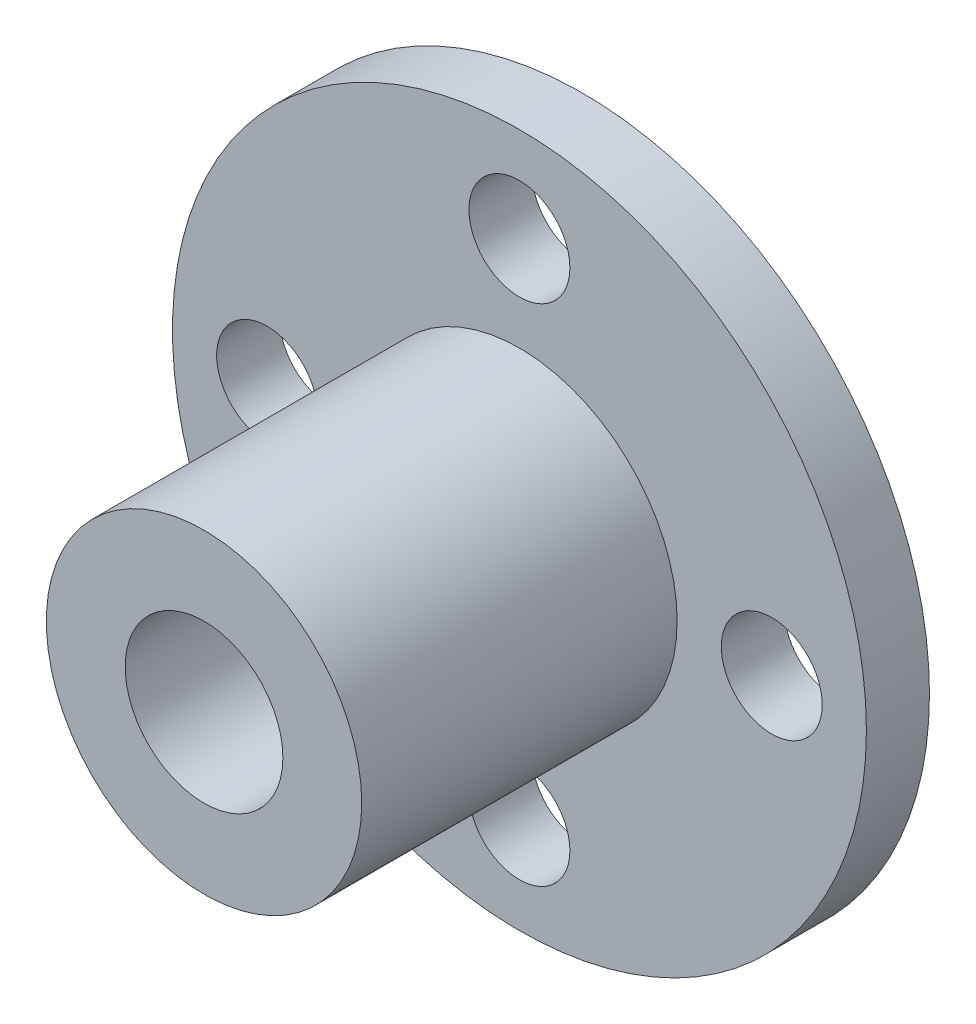
ISO-10303-21;
HEADER;
FILE_DESCRIPTION(('STEP AP214'),'2;1');
FILE_NAME('part.step','',(''),(''),'','','');
FILE_SCHEMA(('AUTOMOTIVE_DESIGN { 1 0 10303 214 1 1 1 1 }'));
ENDSEC;
DATA;
#1=APPLICATION_CONTEXT('core data for automotive mechanical design processes');
#2=APPLICATION_PROTOCOL_DEFINITION('international standard','automotive_design',2000,#1);
#3=PRODUCT_CONTEXT('',#1,'mechanical');
#4=PRODUCT('Part','Part','',(#3));
#5=PRODUCT_RELATED_PRODUCT_CATEGORY('part','',(#4));
#6=PRODUCT_DEFINITION_FORMATION('','',#4);
#7=PRODUCT_DEFINITION_CONTEXT('part definition',#1,'design');
#8=PRODUCT_DEFINITION('design','',#6,#7);
#9=PRODUCT_DEFINITION_SHAPE('','',#8);
#10=(LENGTH_UNIT() NAMED_UNIT(*) SI_UNIT(.MILLI.,.METRE.));
#11=(NAMED_UNIT(*) PLANE_ANGLE_UNIT() SI_UNIT($,.RADIAN.));
#12=(NAMED_UNIT(*) SI_UNIT($,.STERADIAN.) SOLID_ANGLE_UNIT());
#13=UNCERTAINTY_MEASURE_WITH_UNIT(LENGTH_MEASURE(1.E-05),#10,'distance_accuracy_value','');
#14=(GEOMETRIC_REPRESENTATION_CONTEXT(3) GLOBAL_UNCERTAINTY_ASSIGNED_CONTEXT((#13)) GLOBAL_UNIT_ASSIGNED_CONTEXT((#10,
#11,#12)) REPRESENTATION_CONTEXT('',''));
#15=CARTESIAN_POINT('',(0.,0.,0.));
#16=DIRECTION('',(0.,0.,1.));
#17=DIRECTION('',(1.,0.,0.));
#18=AXIS2_PLACEMENT_3D('',#15,#16,#17);
#19=CARTESIAN_POINT('',(0.,0.,2.));
#20=DIRECTION('',(0.,0.,-1.));
#21=DIRECTION('',(-1.,0.,0.));
#22=AXIS2_PLACEMENT_3D('',#19,#20,#21);
#23=CYLINDRICAL_SURFACE('',#22,11.);
#24=CARTESIAN_POINT('',(0.,0.,2.));
#25=DIRECTION('',(0.,0.,1.));
#26=DIRECTION('',(1.,0.,0.));
#27=AXIS2_PLACEMENT_3D('',#24,#25,#26);
#28=CIRCLE('',#27,11.);
#29=CARTESIAN_POINT('',(11.,0.,2.));
#30=VERTEX_POINT('',#29);
#31=EDGE_CURVE('E10',#30,#30,#28,.T.);
#32=ORIENTED_EDGE('',*,*,#31,.F.);
#33=EDGE_LOOP('',(#32));
#34=FACE_BOUND('',#33,.T.);
#35=CARTESIAN_POINT('',(0.,0.,0.));
#36=DIRECTION('',(0.,0.,1.));
#37=DIRECTION('',(1.,0.,0.));
#38=AXIS2_PLACEMENT_3D('',#35,#36,#37);
#39=CIRCLE('',#38,11.);
#40=CARTESIAN_POINT('',(11.,0.,0.));
#41=VERTEX_POINT('',#40);
#42=EDGE_CURVE('E39',#41,#41,#39,.T.);
#43=ORIENTED_EDGE('',*,*,#42,.T.);
#44=EDGE_LOOP('',(#43));
#45=FACE_BOUND('',#44,.T.);
#46=ADVANCED_FACE('F32',(#34,#45),#23,.T.);
#47=CARTESIAN_POINT('',(0.,0.,2.));
#48=DIRECTION('',(0.,0.,1.));
#49=DIRECTION('',(1.,0.,0.));
#50=AXIS2_PLACEMENT_3D('',#47,#48,#49);
#51=PLANE('',#50);
#52=CARTESIAN_POINT('',(8.,0.,2.));
#53=DIRECTION('',(0.,0.,1.));
#54=DIRECTION('',(1.,0.,0.));
#55=AXIS2_PLACEMENT_3D('',#52,#53,#54);
#56=CIRCLE('',#55,1.6);
#57=CARTESIAN_POINT('',(9.6,0.,2.));
#58=VERTEX_POINT('',#57);
#59=EDGE_CURVE('E63',#58,#58,#56,.T.);
#60=ORIENTED_EDGE('',*,*,#59,.F.);
#61=EDGE_LOOP('',(#60));
#62=FACE_BOUND('',#61,.T.);
#63=CARTESIAN_POINT('',(-8.,0.,2.));
#64=DIRECTION('',(0.,0.,1.));
#65=DIRECTION('',(1.,0.,0.));
#66=AXIS2_PLACEMENT_3D('',#63,#64,#65);
#67=CIRCLE('',#66,1.6);
#68=CARTESIAN_POINT('',(-6.4,0.,2.));
#69=VERTEX_POINT('',#68);
#70=EDGE_CURVE('E52',#69,#69,#67,.T.);
#71=ORIENTED_EDGE('',*,*,#70,.F.);
#72=EDGE_LOOP('',(#71));
#73=FACE_BOUND('',#72,.T.);
#74=CARTESIAN_POINT('',(0.,-8.,2.));
#75=DIRECTION('',(0.,0.,1.));
#76=DIRECTION('',(1.,0.,0.));
#77=AXIS2_PLACEMENT_3D('',#74,#75,#76);
#78=CIRCLE('',#77,1.6);
#79=CARTESIAN_POINT('',(1.6,-8.,2.));
#80=VERTEX_POINT('',#79);
#81=EDGE_CURVE('E51',#80,#80,#78,.T.);
#82=ORIENTED_EDGE('',*,*,#81,.F.);
#83=EDGE_LOOP('',(#82));
#84=FACE_BOUND('',#83,.T.);
#85=CARTESIAN_POINT('',(0.,8.,2.));
#86=DIRECTION('',(0.,0.,1.));
#87=DIRECTION('',(1.,0.,0.));
#88=AXIS2_PLACEMENT_3D('',#85,#86,#87);
#89=CIRCLE('',#88,1.6);
#90=CARTESIAN_POINT('',(1.6,8.,2.));
#91=VERTEX_POINT('',#90);
#92=EDGE_CURVE('E68',#91,#91,#89,.T.);
#93=ORIENTED_EDGE('',*,*,#92,.F.);
#94=EDGE_LOOP('',(#93));
#95=FACE_BOUND('',#94,.T.);
#96=CARTESIAN_POINT('',(0.,0.,2.));
#97=DIRECTION('',(0.,0.,1.));
#98=DIRECTION('',(1.,0.,0.));
#99=AXIS2_PLACEMENT_3D('',#96,#97,#98);
#100=CIRCLE('',#99,5.);
#101=CARTESIAN_POINT('',(5.,0.,2.));
#102=VERTEX_POINT('',#101);
#103=EDGE_CURVE('E47',#102,#102,#100,.T.);
#104=ORIENTED_EDGE('',*,*,#103,.F.);
#105=EDGE_LOOP('',(#104));
#106=FACE_BOUND('',#105,.T.);
#107=ORIENTED_EDGE('',*,*,#31,.T.);
#108=EDGE_LOOP('',(#107));
#109=FACE_BOUND('',#108,.T.);
#110=ADVANCED_FACE('F87',(#62,#73,#84,#95,#106,#109),#51,.T.);
#111=CARTESIAN_POINT('',(0.,0.,0.));
#112=DIRECTION('',(0.,0.,1.));
#113=DIRECTION('',(1.,0.,0.));
#114=AXIS2_PLACEMENT_3D('',#111,#112,#113);
#115=PLANE('',#114);
#116=CARTESIAN_POINT('',(8.,0.,0.));
#117=DIRECTION('',(0.,0.,1.));
#118=DIRECTION('',(1.,0.,0.));
#119=AXIS2_PLACEMENT_3D('',#116,#117,#118);
#120=CIRCLE('',#119,1.6);
#121=CARTESIAN_POINT('',(9.6,0.,0.));
#122=VERTEX_POINT('',#121);
#123=EDGE_CURVE('E35',#122,#122,#120,.T.);
#124=ORIENTED_EDGE('',*,*,#123,.T.);
#125=EDGE_LOOP('',(#124));
#126=FACE_BOUND('',#125,.T.);
#127=CARTESIAN_POINT('',(-8.,0.,0.));
#128=DIRECTION('',(0.,0.,1.));
#129=DIRECTION('',(1.,0.,0.));
#130=AXIS2_PLACEMENT_3D('',#127,#128,#129);
#131=CIRCLE('',#130,1.6);
#132=CARTESIAN_POINT('',(-6.4,0.,0.));
#133=VERTEX_POINT('',#132);
#134=EDGE_CURVE('E49',#133,#133,#131,.T.);
#135=ORIENTED_EDGE('',*,*,#134,.T.);
#136=EDGE_LOOP('',(#135));
#137=FACE_BOUND('',#136,.T.);
#138=CARTESIAN_POINT('',(0.,-8.,0.));
#139=DIRECTION('',(0.,0.,1.));
#140=DIRECTION('',(1.,0.,0.));
#141=AXIS2_PLACEMENT_3D('',#138,#139,#140);
#142=CIRCLE('',#141,1.6);
#143=CARTESIAN_POINT('',(1.6,-8.,0.));
#144=VERTEX_POINT('',#143);
#145=EDGE_CURVE('E56',#144,#144,#142,.T.);
#146=ORIENTED_EDGE('',*,*,#145,.T.);
#147=EDGE_LOOP('',(#146));
#148=FACE_BOUND('',#147,.T.);
#149=CARTESIAN_POINT('',(0.,8.,0.));
#150=DIRECTION('',(0.,0.,1.));
#151=DIRECTION('',(1.,0.,0.));
#152=AXIS2_PLACEMENT_3D('',#149,#150,#151);
#153=CIRCLE('',#152,1.6);
#154=CARTESIAN_POINT('',(1.6,8.,0.));
#155=VERTEX_POINT('',#154);
#156=EDGE_CURVE('E71',#155,#155,#153,.T.);
#157=ORIENTED_EDGE('',*,*,#156,.T.);
#158=EDGE_LOOP('',(#157));
#159=FACE_BOUND('',#158,.T.);
#160=CARTESIAN_POINT('',(0.,0.,0.));
#161=DIRECTION('',(0.,0.,1.));
#162=DIRECTION('',(1.,0.,0.));
#163=AXIS2_PLACEMENT_3D('',#160,#161,#162);
#164=CIRCLE('',#163,2.5);
#165=CARTESIAN_POINT('',(2.5,0.,0.));
#166=VERTEX_POINT('',#165);
#167=EDGE_CURVE('E75',#166,#166,#164,.T.);
#168=ORIENTED_EDGE('',*,*,#167,.T.);
#169=EDGE_LOOP('',(#168));
#170=FACE_BOUND('',#169,.T.);
#171=ORIENTED_EDGE('',*,*,#42,.F.);
#172=EDGE_LOOP('',(#171));
#173=FACE_BOUND('',#172,.T.);
#174=ADVANCED_FACE('F89',(#126,#137,#148,#159,#170,#173),#115,.F.);
#175=CARTESIAN_POINT('',(0.,0.,12.));
#176=DIRECTION('',(0.,0.,-1.));
#177=DIRECTION('',(-1.,0.,0.));
#178=AXIS2_PLACEMENT_3D('',#175,#176,#177);
#179=CYLINDRICAL_SURFACE('',#178,5.);
#180=CARTESIAN_POINT('',(0.,0.,12.));
#181=DIRECTION('',(0.,0.,1.));
#182=DIRECTION('',(1.,0.,0.));
#183=AXIS2_PLACEMENT_3D('',#180,#181,#182);
#184=CIRCLE('',#183,5.);
#185=CARTESIAN_POINT('',(5.,0.,12.));
#186=VERTEX_POINT('',#185);
#187=EDGE_CURVE('E44',#186,#186,#184,.T.);
#188=ORIENTED_EDGE('',*,*,#187,.F.);
#189=EDGE_LOOP('',(#188));
#190=FACE_BOUND('',#189,.T.);
#191=ORIENTED_EDGE('',*,*,#103,.T.);
#192=EDGE_LOOP('',(#191));
#193=FACE_BOUND('',#192,.T.);
#194=ADVANCED_FACE('F85',(#190,#193),#179,.T.);
#195=CARTESIAN_POINT('',(0.,0.,12.));
#196=DIRECTION('',(0.,0.,1.));
#197=DIRECTION('',(1.,0.,0.));
#198=AXIS2_PLACEMENT_3D('',#195,#196,#197);
#199=PLANE('',#198);
#200=CARTESIAN_POINT('',(0.,0.,12.));
#201=DIRECTION('',(0.,0.,1.));
#202=DIRECTION('',(1.,0.,0.));
#203=AXIS2_PLACEMENT_3D('',#200,#201,#202);
#204=CIRCLE('',#203,2.5);
#205=CARTESIAN_POINT('',(2.5,0.,12.));
#206=VERTEX_POINT('',#205);
#207=EDGE_CURVE('E74',#206,#206,#204,.T.);
#208=ORIENTED_EDGE('',*,*,#207,.F.);
#209=EDGE_LOOP('',(#208));
#210=FACE_BOUND('',#209,.T.);
#211=ORIENTED_EDGE('',*,*,#187,.T.);
#212=EDGE_LOOP('',(#211));
#213=FACE_BOUND('',#212,.T.);
#214=ADVANCED_FACE('F103',(#210,#213),#199,.T.);
#215=CARTESIAN_POINT('',(0.,0.,0.));
#216=DIRECTION('',(0.,0.,1.));
#217=DIRECTION('',(1.,0.,0.));
#218=AXIS2_PLACEMENT_3D('',#215,#216,#217);
#219=CYLINDRICAL_SURFACE('',#218,2.5);
#220=ORIENTED_EDGE('',*,*,#167,.F.);
#221=EDGE_LOOP('',(#220));
#222=FACE_BOUND('',#221,.T.);
#223=ORIENTED_EDGE('',*,*,#207,.T.);
#224=EDGE_LOOP('',(#223));
#225=FACE_BOUND('',#224,.T.);
#226=ADVANCED_FACE('F107',(#222,#225),#219,.F.);
#227=CARTESIAN_POINT('',(0.,8.,2.));
#228=DIRECTION('',(0.,0.,1.));
#229=DIRECTION('',(1.,0.,0.));
#230=AXIS2_PLACEMENT_3D('',#227,#228,#229);
#231=CYLINDRICAL_SURFACE('',#230,1.6);
#232=ORIENTED_EDGE('',*,*,#92,.T.);
#233=EDGE_LOOP('',(#232));
#234=FACE_BOUND('',#233,.T.);
#235=ORIENTED_EDGE('',*,*,#156,.F.);
#236=EDGE_LOOP('',(#235));
#237=FACE_BOUND('',#236,.T.);
#238=ADVANCED_FACE('F111',(#234,#237),#231,.F.);
#239=CARTESIAN_POINT('',(0.,-8.,2.));
#240=DIRECTION('',(0.,0.,1.));
#241=DIRECTION('',(1.,0.,0.));
#242=AXIS2_PLACEMENT_3D('',#239,#240,#241);
#243=CYLINDRICAL_SURFACE('',#242,1.6);
#244=ORIENTED_EDGE('',*,*,#81,.T.);
#245=EDGE_LOOP('',(#244));
#246=FACE_BOUND('',#245,.T.);
#247=ORIENTED_EDGE('',*,*,#145,.F.);
#248=EDGE_LOOP('',(#247));
#249=FACE_BOUND('',#248,.T.);
#250=ADVANCED_FACE('F115',(#246,#249),#243,.F.);
#251=CARTESIAN_POINT('',(-8.,0.,2.));
#252=DIRECTION('',(0.,0.,1.));
#253=DIRECTION('',(1.,0.,0.));
#254=AXIS2_PLACEMENT_3D('',#251,#252,#253);
#255=CYLINDRICAL_SURFACE('',#254,1.6);
#256=ORIENTED_EDGE('',*,*,#70,.T.);
#257=EDGE_LOOP('',(#256));
#258=FACE_BOUND('',#257,.T.);
#259=ORIENTED_EDGE('',*,*,#134,.F.);
#260=EDGE_LOOP('',(#259));
#261=FACE_BOUND('',#260,.T.);
#262=ADVANCED_FACE('F119',(#258,#261),#255,.F.);
#263=CARTESIAN_POINT('',(8.,0.,2.));
#264=DIRECTION('',(0.,0.,1.));
#265=DIRECTION('',(1.,0.,0.));
#266=AXIS2_PLACEMENT_3D('',#263,#264,#265);
#267=CYLINDRICAL_SURFACE('',#266,1.6);
#268=ORIENTED_EDGE('',*,*,#59,.T.);
#269=EDGE_LOOP('',(#268));
#270=FACE_BOUND('',#269,.T.);
#271=ORIENTED_EDGE('',*,*,#123,.F.);
#272=EDGE_LOOP('',(#271));
#273=FACE_BOUND('',#272,.T.);
#274=ADVANCED_FACE('F123',(#270,#273),#267,.F.);
#275=CLOSED_SHELL('',(#46,#110,#174,#194,#214,#226,#238,#250,#262,#274));
#276=MANIFOLD_SOLID_BREP('B2',#275);
#277=ADVANCED_BREP_SHAPE_REPRESENTATION('',(#18,#276),#14);
#278=SHAPE_DEFINITION_REPRESENTATION(#9,#277);
ENDSEC;
END-ISO-10303-21;
